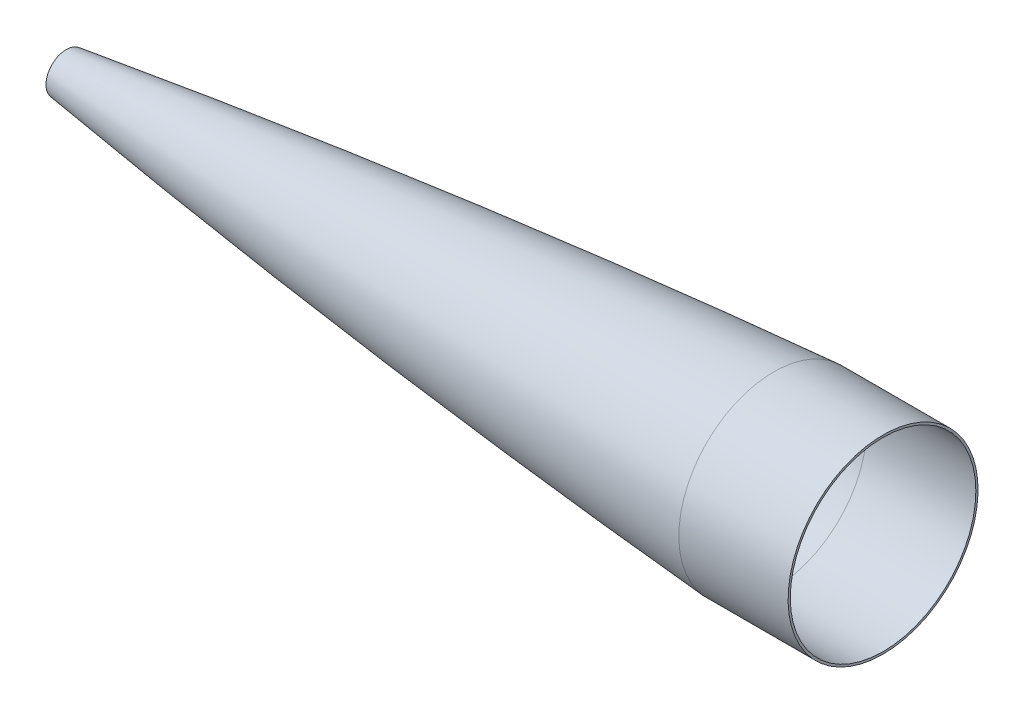
ISO-10303-21;
HEADER;
FILE_DESCRIPTION(('STEP AP214'),'2;1');
FILE_NAME('part.step','',(''),(''),'','','');
FILE_SCHEMA(('AUTOMOTIVE_DESIGN { 1 0 10303 214 1 1 1 1 }'));
ENDSEC;
DATA;
#1=APPLICATION_CONTEXT('core data for automotive mechanical design processes');
#2=APPLICATION_PROTOCOL_DEFINITION('international standard','automotive_design',2000,#1);
#3=PRODUCT_CONTEXT('',#1,'mechanical');
#4=PRODUCT('Part','Part','',(#3));
#5=PRODUCT_RELATED_PRODUCT_CATEGORY('part','',(#4));
#6=PRODUCT_DEFINITION_FORMATION('','',#4);
#7=PRODUCT_DEFINITION_CONTEXT('part definition',#1,'design');
#8=PRODUCT_DEFINITION('design','',#6,#7);
#9=PRODUCT_DEFINITION_SHAPE('','',#8);
#10=(LENGTH_UNIT() NAMED_UNIT(*) SI_UNIT(.MILLI.,.METRE.));
#11=(NAMED_UNIT(*) PLANE_ANGLE_UNIT() SI_UNIT($,.RADIAN.));
#12=(NAMED_UNIT(*) SI_UNIT($,.STERADIAN.) SOLID_ANGLE_UNIT());
#13=UNCERTAINTY_MEASURE_WITH_UNIT(LENGTH_MEASURE(1.E-05),#10,'distance_accuracy_value','');
#14=(GEOMETRIC_REPRESENTATION_CONTEXT(3) GLOBAL_UNCERTAINTY_ASSIGNED_CONTEXT((#13)) GLOBAL_UNIT_ASSIGNED_CONTEXT((#10,
#11,#12)) REPRESENTATION_CONTEXT('',''));
#15=CARTESIAN_POINT('',(0.,0.,0.));
#16=DIRECTION('',(0.,0.,1.));
#17=DIRECTION('',(1.,0.,0.));
#18=AXIS2_PLACEMENT_3D('',#15,#16,#17);
#19=CARTESIAN_POINT('',(1520.67256201447,-1.35003119794419E-10,-3.01020237672489E-12));
#20=DIRECTION('',(-1.,0.,0.));
#21=DIRECTION('',(0.,-1.,0.));
#22=AXIS2_PLACEMENT_3D('',#19,#20,#21);
#23=DEGENERATE_TOROIDAL_SURFACE('',#22,10185.3460356525,10300.2386312827,.F.);
#24=CARTESIAN_POINT('',(763.161647781223,-6.77205898236431E-11,-1.5106940595634E-12));
#25=DIRECTION('',(-1.,0.,0.));
#26=DIRECTION('',(0.,-1.,0.));
#27=AXIS2_PLACEMENT_3D('',#24,#25,#26);
#28=CIRCLE('',#27,87.);
#29=CARTESIAN_POINT('',(763.161647781215,-87.0000000000677,-1.5106940595634E-12));
#30=VERTEX_POINT('',#29);
#31=EDGE_CURVE('E10',#30,#30,#28,.T.);
#32=ORIENTED_EDGE('',*,*,#31,.T.);
#33=EDGE_LOOP('',(#32));
#34=FACE_BOUND('',#33,.T.);
#35=CARTESIAN_POINT('',(114.997091285507,-1.33381922687368E-10,-3.01020237672489E-12));
#36=DIRECTION('',(-1.,0.,0.));
#37=DIRECTION('',(0.,-1.,0.));
#38=AXIS2_PLACEMENT_3D('',#35,#36,#37);
#39=CIRCLE('',#38,18.5254027947259);
#40=CARTESIAN_POINT('',(114.997091285507,-18.5254027948593,-3.01020237672489E-12));
#41=VERTEX_POINT('',#40);
#42=EDGE_CURVE('E48',#41,#41,#39,.F.);
#43=ORIENTED_EDGE('',*,*,#42,.T.);
#44=EDGE_LOOP('',(#43));
#45=FACE_BOUND('',#44,.T.);
#46=ADVANCED_FACE('F45',(#34,#45),#23,.F.);
#47=CARTESIAN_POINT('',(763.235294117049,-6.77271249703122E-11,-1.51083984398845E-12));
#48=DIRECTION('',(-1.,0.,0.));
#49=DIRECTION('',(0.,-1.,0.));
#50=AXIS2_PLACEMENT_3D('',#47,#48,#49);
#51=CYLINDRICAL_SURFACE('',#50,85.0000000000077);
#52=CARTESIAN_POINT('',(763.23529411704,-6.77271249703113E-11,-1.51083984398843E-12));
#53=DIRECTION('',(-1.,0.,0.));
#54=DIRECTION('',(0.,-1.,0.));
#55=AXIS2_PLACEMENT_3D('',#52,#53,#54);
#56=CIRCLE('',#55,85.0000000000153);
#57=CARTESIAN_POINT('',(763.235294117032,-85.000000000083,-1.51083984398843E-12));
#58=VERTEX_POINT('',#57);
#59=EDGE_CURVE('E53',#58,#58,#56,.T.);
#60=ORIENTED_EDGE('',*,*,#59,.T.);
#61=EDGE_LOOP('',(#60));
#62=FACE_BOUND('',#61,.T.);
#63=CARTESIAN_POINT('',(863.235294117107,0.,-1.70879188520494E-12));
#64=DIRECTION('',(-1.,-6.77148785023207E-13,0.));
#65=DIRECTION('',(6.77148785023207E-13,-1.,0.));
#66=AXIS2_PLACEMENT_3D('',#63,#64,#65);
#67=CIRCLE('',#66,84.9999999999323);
#68=CARTESIAN_POINT('',(863.235294117164,-84.9999999999323,-1.70879188520494E-12));
#69=VERTEX_POINT('',#68);
#70=EDGE_CURVE('E68',#69,#69,#67,.T.);
#71=ORIENTED_EDGE('',*,*,#70,.F.);
#72=EDGE_LOOP('',(#71));
#73=FACE_BOUND('',#72,.T.);
#74=ADVANCED_FACE('F94',(#62,#73),#51,.F.);
#75=CARTESIAN_POINT('',(1520.67256201447,-1.35003119794419E-10,-3.01020237672489E-12));
#76=DIRECTION('',(-1.,0.,0.));
#77=DIRECTION('',(0.,-1.,0.));
#78=AXIS2_PLACEMENT_3D('',#75,#76,#77);
#79=DEGENERATE_TOROIDAL_SURFACE('',#78,10185.3460356525,10298.2386312827,.F.);
#80=ORIENTED_EDGE('',*,*,#59,.F.);
#81=EDGE_LOOP('',(#80));
#82=FACE_BOUND('',#81,.T.);
#83=CARTESIAN_POINT('',(161.531525619511,-1.43338049309014E-11,-3.19754952171763E-13));
#84=DIRECTION('',(-1.,0.,0.));
#85=DIRECTION('',(0.,-1.,0.));
#86=AXIS2_PLACEMENT_3D('',#83,#84,#85);
#87=CIRCLE('',#86,22.8102400924436);
#88=CARTESIAN_POINT('',(161.531525619509,-22.8102400924579,-3.19754952171763E-13));
#89=VERTEX_POINT('',#88);
#90=EDGE_CURVE('E58',#89,#89,#87,.T.);
#91=ORIENTED_EDGE('',*,*,#90,.T.);
#92=EDGE_LOOP('',(#91));
#93=FACE_BOUND('',#92,.T.);
#94=ADVANCED_FACE('F100',(#82,#93),#79,.T.);
#95=CARTESIAN_POINT('',(161.531525619512,-6.77271249703121E-11,-3.19754952171765E-13));
#96=DIRECTION('',(-1.,0.,0.));
#97=DIRECTION('',(0.,-1.,0.));
#98=AXIS2_PLACEMENT_3D('',#95,#96,#97);
#99=PLANE('',#98);
#100=CARTESIAN_POINT('',(161.531525619512,-1.86297938240353E-13,0.));
#101=DIRECTION('',(-1.,0.,0.));
#102=DIRECTION('',(0.,-1.,0.));
#103=AXIS2_PLACEMENT_3D('',#100,#101,#102);
#104=CIRCLE('',#103,3.);
#105=CARTESIAN_POINT('',(161.531525619512,-3.00000000000019,0.));
#106=VERTEX_POINT('',#105);
#107=EDGE_CURVE('E72',#106,#106,#104,.F.);
#108=ORIENTED_EDGE('',*,*,#107,.F.);
#109=EDGE_LOOP('',(#108));
#110=FACE_BOUND('',#109,.T.);
#111=ORIENTED_EDGE('',*,*,#90,.F.);
#112=EDGE_LOOP('',(#111));
#113=FACE_BOUND('',#112,.T.);
#114=ADVANCED_FACE('F107',(#110,#113),#99,.F.);
#115=CARTESIAN_POINT('',(863.235294117049,86.9999999999322,-1.70879188520482E-12));
#116=DIRECTION('',(1.,6.77148785023207E-13,0.));
#117=DIRECTION('',(-6.77148785023207E-13,1.,0.));
#118=AXIS2_PLACEMENT_3D('',#115,#116,#117);
#119=PLANE('',#118);
#120=ORIENTED_EDGE('',*,*,#70,.T.);
#121=EDGE_LOOP('',(#120));
#122=FACE_BOUND('',#121,.T.);
#123=CARTESIAN_POINT('',(863.235294117108,0.,-1.70879188520494E-12));
#124=DIRECTION('',(-1.,-6.77148785023207E-13,0.));
#125=DIRECTION('',(6.77148785023207E-13,-1.,0.));
#126=AXIS2_PLACEMENT_3D('',#123,#124,#125);
#127=CIRCLE('',#126,86.9999999999323);
#128=CARTESIAN_POINT('',(863.235294117167,-86.9999999999323,-1.70879188520494E-12));
#129=VERTEX_POINT('',#128);
#130=EDGE_CURVE('E64',#129,#129,#127,.T.);
#131=ORIENTED_EDGE('',*,*,#130,.F.);
#132=EDGE_LOOP('',(#131));
#133=FACE_BOUND('',#132,.T.);
#134=ADVANCED_FACE('F112',(#122,#133),#119,.T.);
#135=CARTESIAN_POINT('',(763.235294117049,-6.77271249703122E-11,-1.51083984398845E-12));
#136=DIRECTION('',(-1.,0.,0.));
#137=DIRECTION('',(0.,-1.,0.));
#138=AXIS2_PLACEMENT_3D('',#135,#136,#137);
#139=CYLINDRICAL_SURFACE('',#138,87.);
#140=ORIENTED_EDGE('',*,*,#31,.F.);
#141=EDGE_LOOP('',(#140));
#142=FACE_BOUND('',#141,.T.);
#143=ORIENTED_EDGE('',*,*,#130,.T.);
#144=EDGE_LOOP('',(#143));
#145=FACE_BOUND('',#144,.T.);
#146=ADVANCED_FACE('F87',(#142,#145),#139,.T.);
#147=CARTESIAN_POINT('',(114.997091285508,-1.32628729456758E-13,50.));
#148=DIRECTION('',(-1.,0.,0.));
#149=DIRECTION('',(0.,-1.,0.));
#150=AXIS2_PLACEMENT_3D('',#147,#148,#149);
#151=PLANE('',#150);
#152=CARTESIAN_POINT('',(114.997091285508,-1.32628729456758E-13,0.));
#153=DIRECTION('',(-1.,0.,0.));
#154=DIRECTION('',(0.,-1.,0.));
#155=AXIS2_PLACEMENT_3D('',#152,#153,#154);
#156=CIRCLE('',#155,3.);
#157=CARTESIAN_POINT('',(114.997091285508,-3.00000000000013,0.));
#158=VERTEX_POINT('',#157);
#159=EDGE_CURVE('E76',#158,#158,#156,.T.);
#160=ORIENTED_EDGE('',*,*,#159,.F.);
#161=EDGE_LOOP('',(#160));
#162=FACE_BOUND('',#161,.T.);
#163=ORIENTED_EDGE('',*,*,#42,.F.);
#164=EDGE_LOOP('',(#163));
#165=FACE_BOUND('',#164,.T.);
#166=ADVANCED_FACE('F84',(#162,#165),#151,.T.);
#167=CARTESIAN_POINT('',(863.236294117167,-9.95589815619527E-13,0.));
#168=DIRECTION('',(-1.,0.,0.));
#169=DIRECTION('',(0.,-1.,0.));
#170=AXIS2_PLACEMENT_3D('',#167,#168,#169);
#171=CYLINDRICAL_SURFACE('',#170,3.);
#172=ORIENTED_EDGE('',*,*,#159,.T.);
#173=EDGE_LOOP('',(#172));
#174=FACE_BOUND('',#173,.T.);
#175=ORIENTED_EDGE('',*,*,#107,.T.);
#176=EDGE_LOOP('',(#175));
#177=FACE_BOUND('',#176,.T.);
#178=ADVANCED_FACE('F81',(#174,#177),#171,.F.);
#179=CLOSED_SHELL('',(#46,#74,#94,#114,#134,#146,#166,#178));
#180=MANIFOLD_SOLID_BREP('B2',#179);
#181=ADVANCED_BREP_SHAPE_REPRESENTATION('',(#18,#180),#14);
#182=SHAPE_DEFINITION_REPRESENTATION(#9,#181);
ENDSEC;
END-ISO-10303-21;
